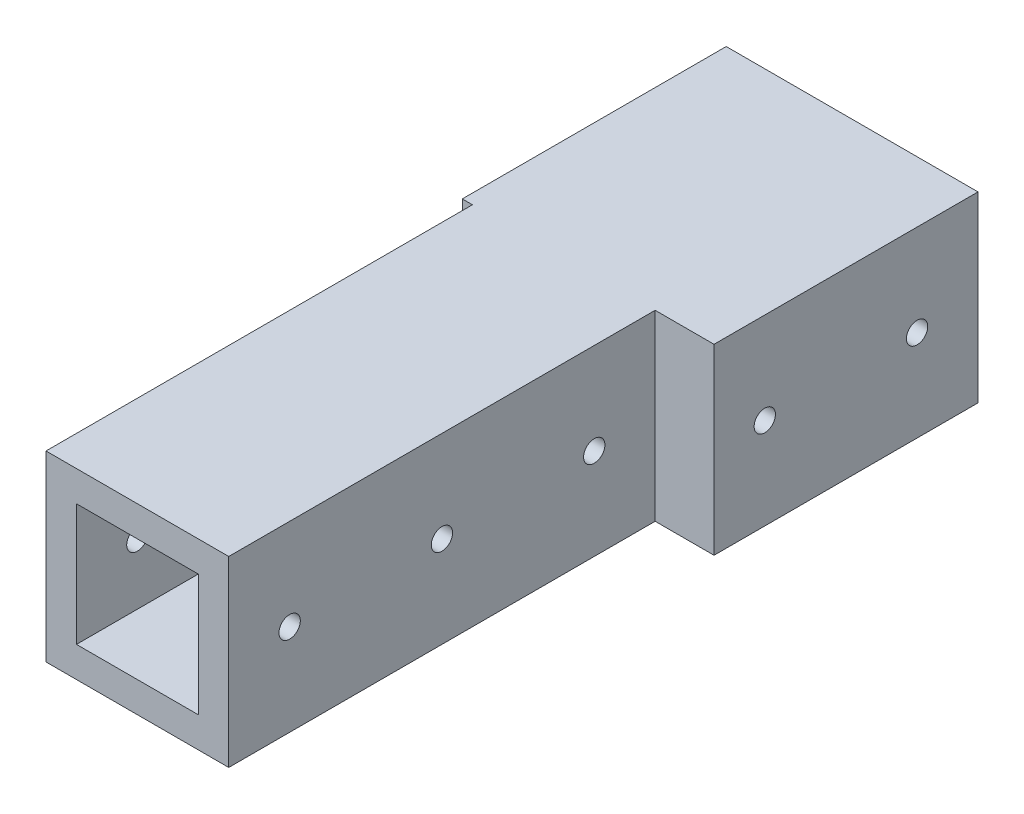
ISO-10303-21;
HEADER;
FILE_DESCRIPTION(('STEP AP214'),'2;1');
FILE_NAME('part.step','',(''),(''),'','','');
FILE_SCHEMA(('AUTOMOTIVE_DESIGN { 1 0 10303 214 1 1 1 1 }'));
ENDSEC;
DATA;
#1=APPLICATION_CONTEXT('core data for automotive mechanical design processes');
#2=APPLICATION_PROTOCOL_DEFINITION('international standard','automotive_design',2000,#1);
#3=PRODUCT_CONTEXT('',#1,'mechanical');
#4=PRODUCT('Part','Part','',(#3));
#5=PRODUCT_RELATED_PRODUCT_CATEGORY('part','',(#4));
#6=PRODUCT_DEFINITION_FORMATION('','',#4);
#7=PRODUCT_DEFINITION_CONTEXT('part definition',#1,'design');
#8=PRODUCT_DEFINITION('design','',#6,#7);
#9=PRODUCT_DEFINITION_SHAPE('','',#8);
#10=(LENGTH_UNIT() NAMED_UNIT(*) SI_UNIT(.MILLI.,.METRE.));
#11=(NAMED_UNIT(*) PLANE_ANGLE_UNIT() SI_UNIT($,.RADIAN.));
#12=(NAMED_UNIT(*) SI_UNIT($,.STERADIAN.) SOLID_ANGLE_UNIT());
#13=UNCERTAINTY_MEASURE_WITH_UNIT(LENGTH_MEASURE(1.E-05),#10,'distance_accuracy_value','');
#14=(GEOMETRIC_REPRESENTATION_CONTEXT(3) GLOBAL_UNCERTAINTY_ASSIGNED_CONTEXT((#13)) GLOBAL_UNIT_ASSIGNED_CONTEXT((#10,
#11,#12)) REPRESENTATION_CONTEXT('',''));
#15=CARTESIAN_POINT('',(0.,0.,0.));
#16=DIRECTION('',(0.,0.,1.));
#17=DIRECTION('',(1.,0.,0.));
#18=AXIS2_PLACEMENT_3D('',#15,#16,#17);
#19=CARTESIAN_POINT('',(0.,0.,68.));
#20=DIRECTION('',(1.,0.,0.));
#21=DIRECTION('',(0.,1.,0.));
#22=AXIS2_PLACEMENT_3D('',#19,#20,#21);
#23=PLANE('',#22);
#24=CARTESIAN_POINT('',(0.,-9.,32.));
#25=DIRECTION('',(1.,0.,0.));
#26=DIRECTION('',(0.,1.,0.));
#27=AXIS2_PLACEMENT_3D('',#24,#25,#26);
#28=CIRCLE('',#27,1.05);
#29=CARTESIAN_POINT('',(0.,-7.95,32.));
#30=VERTEX_POINT('',#29);
#31=EDGE_CURVE('E235',#30,#30,#28,.T.);
#32=ORIENTED_EDGE('',*,*,#31,.T.);
#33=EDGE_LOOP('',(#32));
#34=FACE_BOUND('',#33,.T.);
#35=CARTESIAN_POINT('',(0.,-9.,47.));
#36=DIRECTION('',(1.,0.,0.));
#37=DIRECTION('',(0.,1.,0.));
#38=AXIS2_PLACEMENT_3D('',#35,#36,#37);
#39=CIRCLE('',#38,1.05);
#40=CARTESIAN_POINT('',(0.,-7.95,47.));
#41=VERTEX_POINT('',#40);
#42=EDGE_CURVE('E241',#41,#41,#39,.T.);
#43=ORIENTED_EDGE('',*,*,#42,.T.);
#44=EDGE_LOOP('',(#43));
#45=FACE_BOUND('',#44,.T.);
#46=CARTESIAN_POINT('',(0.,-9.,62.));
#47=DIRECTION('',(1.,0.,0.));
#48=DIRECTION('',(0.,1.,0.));
#49=AXIS2_PLACEMENT_3D('',#46,#47,#48);
#50=CIRCLE('',#49,1.05);
#51=CARTESIAN_POINT('',(0.,-7.95,62.));
#52=VERTEX_POINT('',#51);
#53=EDGE_CURVE('E248',#52,#52,#50,.T.);
#54=ORIENTED_EDGE('',*,*,#53,.T.);
#55=EDGE_LOOP('',(#54));
#56=FACE_BOUND('',#55,.T.);
#57=DIRECTION('',(0.,1.,0.));
#58=VECTOR('',#57,1.);
#59=CARTESIAN_POINT('',(0.,0.,26.));
#60=LINE('',#59,#58);
#61=CARTESIAN_POINT('',(0.,-18.,26.));
#62=VERTEX_POINT('',#61);
#63=CARTESIAN_POINT('',(0.,0.,26.));
#64=VERTEX_POINT('',#63);
#65=EDGE_CURVE('E65',#62,#64,#60,.T.);
#66=ORIENTED_EDGE('',*,*,#65,.F.);
#67=DIRECTION('',(0.,0.,-1.));
#68=VECTOR('',#67,1.);
#69=CARTESIAN_POINT('',(0.,-18.,68.));
#70=LINE('',#69,#68);
#71=CARTESIAN_POINT('',(0.,-18.,68.));
#72=VERTEX_POINT('',#71);
#73=EDGE_CURVE('E11',#72,#62,#70,.T.);
#74=ORIENTED_EDGE('',*,*,#73,.F.);
#75=DIRECTION('',(0.,-1.,0.));
#76=VECTOR('',#75,1.);
#77=CARTESIAN_POINT('',(0.,0.,68.));
#78=LINE('',#77,#76);
#79=CARTESIAN_POINT('',(0.,0.,68.));
#80=VERTEX_POINT('',#79);
#81=EDGE_CURVE('E294',#80,#72,#78,.T.);
#82=ORIENTED_EDGE('',*,*,#81,.F.);
#83=DIRECTION('',(0.,0.,-1.));
#84=VECTOR('',#83,1.);
#85=CARTESIAN_POINT('',(0.,0.,68.));
#86=LINE('',#85,#84);
#87=EDGE_CURVE('E310',#80,#64,#86,.T.);
#88=ORIENTED_EDGE('',*,*,#87,.T.);
#89=EDGE_LOOP('',(#66,#74,#82,#88));
#90=FACE_BOUND('',#89,.T.);
#91=ADVANCED_FACE('F44',(#34,#45,#56,#90),#23,.F.);
#92=CARTESIAN_POINT('',(18.,0.,68.));
#93=DIRECTION('',(-1.,0.,0.));
#94=DIRECTION('',(0.,0.,1.));
#95=AXIS2_PLACEMENT_3D('',#92,#93,#94);
#96=PLANE('',#95);
#97=CARTESIAN_POINT('',(18.,-9.,32.));
#98=DIRECTION('',(1.,0.,0.));
#99=DIRECTION('',(0.,0.,-1.));
#100=AXIS2_PLACEMENT_3D('',#97,#98,#99);
#101=CIRCLE('',#100,1.05);
#102=CARTESIAN_POINT('',(18.,-9.,30.95));
#103=VERTEX_POINT('',#102);
#104=EDGE_CURVE('E204',#103,#103,#101,.T.);
#105=ORIENTED_EDGE('',*,*,#104,.F.);
#106=EDGE_LOOP('',(#105));
#107=FACE_BOUND('',#106,.T.);
#108=CARTESIAN_POINT('',(18.,-9.,47.));
#109=DIRECTION('',(1.,0.,0.));
#110=DIRECTION('',(0.,0.,-1.));
#111=AXIS2_PLACEMENT_3D('',#108,#109,#110);
#112=CIRCLE('',#111,1.05);
#113=CARTESIAN_POINT('',(18.,-9.,45.95));
#114=VERTEX_POINT('',#113);
#115=EDGE_CURVE('E212',#114,#114,#112,.T.);
#116=ORIENTED_EDGE('',*,*,#115,.F.);
#117=EDGE_LOOP('',(#116));
#118=FACE_BOUND('',#117,.T.);
#119=CARTESIAN_POINT('',(18.,-9.,62.));
#120=DIRECTION('',(1.,0.,0.));
#121=DIRECTION('',(0.,0.,-1.));
#122=AXIS2_PLACEMENT_3D('',#119,#120,#121);
#123=CIRCLE('',#122,1.05);
#124=CARTESIAN_POINT('',(18.,-9.,60.95));
#125=VERTEX_POINT('',#124);
#126=EDGE_CURVE('E207',#125,#125,#123,.T.);
#127=ORIENTED_EDGE('',*,*,#126,.F.);
#128=EDGE_LOOP('',(#127));
#129=FACE_BOUND('',#128,.T.);
#130=DIRECTION('',(0.,-1.,0.));
#131=VECTOR('',#130,1.);
#132=CARTESIAN_POINT('',(18.,0.,26.));
#133=LINE('',#132,#131);
#134=CARTESIAN_POINT('',(18.,0.,26.));
#135=VERTEX_POINT('',#134);
#136=CARTESIAN_POINT('',(18.,-18.,26.));
#137=VERTEX_POINT('',#136);
#138=EDGE_CURVE('E67',#135,#137,#133,.T.);
#139=ORIENTED_EDGE('',*,*,#138,.F.);
#140=DIRECTION('',(0.,0.,-1.));
#141=VECTOR('',#140,1.);
#142=CARTESIAN_POINT('',(18.,0.,68.));
#143=LINE('',#142,#141);
#144=CARTESIAN_POINT('',(18.,0.,68.));
#145=VERTEX_POINT('',#144);
#146=EDGE_CURVE('E312',#145,#135,#143,.T.);
#147=ORIENTED_EDGE('',*,*,#146,.F.);
#148=DIRECTION('',(0.,1.,0.));
#149=VECTOR('',#148,1.);
#150=CARTESIAN_POINT('',(18.,0.,68.));
#151=LINE('',#150,#149);
#152=CARTESIAN_POINT('',(18.,-18.,68.));
#153=VERTEX_POINT('',#152);
#154=EDGE_CURVE('E305',#153,#145,#151,.T.);
#155=ORIENTED_EDGE('',*,*,#154,.F.);
#156=DIRECTION('',(0.,0.,-1.));
#157=VECTOR('',#156,1.);
#158=CARTESIAN_POINT('',(18.,-18.,68.));
#159=LINE('',#158,#157);
#160=EDGE_CURVE('E53',#153,#137,#159,.T.);
#161=ORIENTED_EDGE('',*,*,#160,.T.);
#162=EDGE_LOOP('',(#139,#147,#155,#161));
#163=FACE_BOUND('',#162,.T.);
#164=ADVANCED_FACE('F372',(#107,#118,#129,#163),#96,.F.);
#165=CARTESIAN_POINT('',(0.,0.,68.));
#166=DIRECTION('',(0.,0.,1.));
#167=DIRECTION('',(1.,0.,0.));
#168=AXIS2_PLACEMENT_3D('',#165,#166,#167);
#169=PLANE('',#168);
#170=ORIENTED_EDGE('',*,*,#81,.T.);
#171=DIRECTION('',(1.,0.,0.));
#172=VECTOR('',#171,1.);
#173=CARTESIAN_POINT('',(0.,-18.,68.));
#174=LINE('',#173,#172);
#175=EDGE_CURVE('E299',#72,#153,#174,.T.);
#176=ORIENTED_EDGE('',*,*,#175,.T.);
#177=ORIENTED_EDGE('',*,*,#154,.T.);
#178=DIRECTION('',(-1.,0.,0.));
#179=VECTOR('',#178,1.);
#180=CARTESIAN_POINT('',(0.,0.,68.));
#181=LINE('',#180,#179);
#182=EDGE_CURVE('E304',#145,#80,#181,.T.);
#183=ORIENTED_EDGE('',*,*,#182,.T.);
#184=EDGE_LOOP('',(#170,#176,#177,#183));
#185=FACE_BOUND('',#184,.T.);
#186=DIRECTION('',(1.,0.,0.));
#187=VECTOR('',#186,1.);
#188=CARTESIAN_POINT('',(3.,-15.,68.));
#189=LINE('',#188,#187);
#190=CARTESIAN_POINT('',(3.,-15.,68.));
#191=VERTEX_POINT('',#190);
#192=CARTESIAN_POINT('',(15.,-15.,68.));
#193=VERTEX_POINT('',#192);
#194=EDGE_CURVE('E260',#191,#193,#189,.T.);
#195=ORIENTED_EDGE('',*,*,#194,.F.);
#196=DIRECTION('',(0.,-1.,0.));
#197=VECTOR('',#196,1.);
#198=CARTESIAN_POINT('',(3.,-3.,68.));
#199=LINE('',#198,#197);
#200=CARTESIAN_POINT('',(3.,-3.,68.));
#201=VERTEX_POINT('',#200);
#202=EDGE_CURVE('E251',#201,#191,#199,.T.);
#203=ORIENTED_EDGE('',*,*,#202,.F.);
#204=DIRECTION('',(-1.,0.,0.));
#205=VECTOR('',#204,1.);
#206=CARTESIAN_POINT('',(3.,-3.,68.));
#207=LINE('',#206,#205);
#208=CARTESIAN_POINT('',(15.,-3.,68.));
#209=VERTEX_POINT('',#208);
#210=EDGE_CURVE('E264',#209,#201,#207,.T.);
#211=ORIENTED_EDGE('',*,*,#210,.F.);
#212=DIRECTION('',(0.,1.,0.));
#213=VECTOR('',#212,1.);
#214=CARTESIAN_POINT('',(15.,-3.,68.));
#215=LINE('',#214,#213);
#216=EDGE_CURVE('E261',#193,#209,#215,.T.);
#217=ORIENTED_EDGE('',*,*,#216,.F.);
#218=EDGE_LOOP('',(#195,#203,#211,#217));
#219=FACE_BOUND('',#218,.T.);
#220=ADVANCED_FACE('F360',(#185,#219),#169,.T.);
#221=CARTESIAN_POINT('',(0.,0.,0.));
#222=DIRECTION('',(0.,0.,1.));
#223=DIRECTION('',(1.,0.,0.));
#224=AXIS2_PLACEMENT_3D('',#221,#222,#223);
#225=PLANE('',#224);
#226=DIRECTION('',(1.,0.,0.));
#227=VECTOR('',#226,1.);
#228=CARTESIAN_POINT('',(0.,-18.,0.));
#229=LINE('',#228,#227);
#230=CARTESIAN_POINT('',(-0.999999999999998,-18.,0.));
#231=VERTEX_POINT('',#230);
#232=CARTESIAN_POINT('',(23.8,-18.,0.));
#233=VERTEX_POINT('',#232);
#234=EDGE_CURVE('E140',#231,#233,#229,.T.);
#235=ORIENTED_EDGE('',*,*,#234,.F.);
#236=DIRECTION('',(0.,-1.,0.));
#237=VECTOR('',#236,1.);
#238=CARTESIAN_POINT('',(-1.,0.,0.));
#239=LINE('',#238,#237);
#240=CARTESIAN_POINT('',(-1.,0.,0.));
#241=VERTEX_POINT('',#240);
#242=EDGE_CURVE('E145',#241,#231,#239,.T.);
#243=ORIENTED_EDGE('',*,*,#242,.F.);
#244=DIRECTION('',(-1.,0.,0.));
#245=VECTOR('',#244,1.);
#246=CARTESIAN_POINT('',(0.,0.,0.));
#247=LINE('',#246,#245);
#248=CARTESIAN_POINT('',(23.8,0.,0.));
#249=VERTEX_POINT('',#248);
#250=EDGE_CURVE('E149',#249,#241,#247,.T.);
#251=ORIENTED_EDGE('',*,*,#250,.F.);
#252=DIRECTION('',(0.,1.,0.));
#253=VECTOR('',#252,1.);
#254=CARTESIAN_POINT('',(23.8,0.,0.));
#255=LINE('',#254,#253);
#256=EDGE_CURVE('E144',#233,#249,#255,.T.);
#257=ORIENTED_EDGE('',*,*,#256,.F.);
#258=EDGE_LOOP('',(#235,#243,#251,#257));
#259=FACE_BOUND('',#258,.T.);
#260=DIRECTION('',(0.,-1.,0.));
#261=VECTOR('',#260,1.);
#262=CARTESIAN_POINT('',(3.,-3.,0.));
#263=LINE('',#262,#261);
#264=CARTESIAN_POINT('',(3.,-3.,0.));
#265=VERTEX_POINT('',#264);
#266=CARTESIAN_POINT('',(3.,-15.,0.));
#267=VERTEX_POINT('',#266);
#268=EDGE_CURVE('E254',#265,#267,#263,.T.);
#269=ORIENTED_EDGE('',*,*,#268,.T.);
#270=DIRECTION('',(1.,0.,0.));
#271=VECTOR('',#270,1.);
#272=CARTESIAN_POINT('',(3.,-15.,0.));
#273=LINE('',#272,#271);
#274=CARTESIAN_POINT('',(15.,-15.,0.));
#275=VERTEX_POINT('',#274);
#276=EDGE_CURVE('E275',#267,#275,#273,.T.);
#277=ORIENTED_EDGE('',*,*,#276,.T.);
#278=DIRECTION('',(0.,1.,0.));
#279=VECTOR('',#278,1.);
#280=CARTESIAN_POINT('',(15.,-3.,0.));
#281=LINE('',#280,#279);
#282=CARTESIAN_POINT('',(15.,-3.,0.));
#283=VERTEX_POINT('',#282);
#284=EDGE_CURVE('E277',#275,#283,#281,.T.);
#285=ORIENTED_EDGE('',*,*,#284,.T.);
#286=DIRECTION('',(-1.,0.,0.));
#287=VECTOR('',#286,1.);
#288=CARTESIAN_POINT('',(3.,-3.,0.));
#289=LINE('',#288,#287);
#290=EDGE_CURVE('E259',#283,#265,#289,.T.);
#291=ORIENTED_EDGE('',*,*,#290,.T.);
#292=EDGE_LOOP('',(#269,#277,#285,#291));
#293=FACE_BOUND('',#292,.T.);
#294=ADVANCED_FACE('F138',(#259,#293),#225,.F.);
#295=CARTESIAN_POINT('',(0.,-18.,68.));
#296=DIRECTION('',(0.,1.,0.));
#297=DIRECTION('',(0.,0.,1.));
#298=AXIS2_PLACEMENT_3D('',#295,#296,#297);
#299=PLANE('',#298);
#300=ORIENTED_EDGE('',*,*,#234,.T.);
#301=DIRECTION('',(0.,0.,-1.));
#302=VECTOR('',#301,1.);
#303=CARTESIAN_POINT('',(23.8,-18.,26.));
#304=LINE('',#303,#302);
#305=CARTESIAN_POINT('',(23.8,-18.,26.));
#306=VERTEX_POINT('',#305);
#307=EDGE_CURVE('E190',#306,#233,#304,.T.);
#308=ORIENTED_EDGE('',*,*,#307,.F.);
#309=DIRECTION('',(-1.,0.,0.));
#310=VECTOR('',#309,1.);
#311=CARTESIAN_POINT('',(23.8,-18.,26.));
#312=LINE('',#311,#310);
#313=EDGE_CURVE('E201',#306,#137,#312,.T.);
#314=ORIENTED_EDGE('',*,*,#313,.T.);
#315=ORIENTED_EDGE('',*,*,#160,.F.);
#316=ORIENTED_EDGE('',*,*,#175,.F.);
#317=ORIENTED_EDGE('',*,*,#73,.T.);
#318=DIRECTION('',(1.,0.,0.));
#319=VECTOR('',#318,1.);
#320=CARTESIAN_POINT('',(-0.999999999999998,-18.,26.));
#321=LINE('',#320,#319);
#322=CARTESIAN_POINT('',(-0.999999999999998,-18.,26.));
#323=VERTEX_POINT('',#322);
#324=EDGE_CURVE('E154',#323,#62,#321,.T.);
#325=ORIENTED_EDGE('',*,*,#324,.F.);
#326=DIRECTION('',(0.,0.,1.));
#327=VECTOR('',#326,1.);
#328=CARTESIAN_POINT('',(-0.999999999999998,-18.,0.));
#329=LINE('',#328,#327);
#330=EDGE_CURVE('E155',#231,#323,#329,.T.);
#331=ORIENTED_EDGE('',*,*,#330,.F.);
#332=EDGE_LOOP('',(#300,#308,#314,#315,#316,#317,#325,#331));
#333=FACE_BOUND('',#332,.T.);
#334=ADVANCED_FACE('F153',(#333),#299,.F.);
#335=CARTESIAN_POINT('',(0.,0.,68.));
#336=DIRECTION('',(0.,-1.,0.));
#337=DIRECTION('',(0.,0.,-1.));
#338=AXIS2_PLACEMENT_3D('',#335,#336,#337);
#339=PLANE('',#338);
#340=ORIENTED_EDGE('',*,*,#250,.T.);
#341=DIRECTION('',(0.,0.,-1.));
#342=VECTOR('',#341,1.);
#343=CARTESIAN_POINT('',(-1.,0.,0.));
#344=LINE('',#343,#342);
#345=CARTESIAN_POINT('',(-1.,0.,26.));
#346=VERTEX_POINT('',#345);
#347=EDGE_CURVE('E165',#346,#241,#344,.T.);
#348=ORIENTED_EDGE('',*,*,#347,.F.);
#349=DIRECTION('',(1.,0.,0.));
#350=VECTOR('',#349,1.);
#351=CARTESIAN_POINT('',(-1.,0.,26.));
#352=LINE('',#351,#350);
#353=EDGE_CURVE('E176',#346,#64,#352,.T.);
#354=ORIENTED_EDGE('',*,*,#353,.T.);
#355=ORIENTED_EDGE('',*,*,#87,.F.);
#356=ORIENTED_EDGE('',*,*,#182,.F.);
#357=ORIENTED_EDGE('',*,*,#146,.T.);
#358=DIRECTION('',(-1.,0.,0.));
#359=VECTOR('',#358,1.);
#360=CARTESIAN_POINT('',(23.8,0.,26.));
#361=LINE('',#360,#359);
#362=CARTESIAN_POINT('',(23.8,0.,26.));
#363=VERTEX_POINT('',#362);
#364=EDGE_CURVE('E193',#363,#135,#361,.T.);
#365=ORIENTED_EDGE('',*,*,#364,.F.);
#366=DIRECTION('',(0.,0.,1.));
#367=VECTOR('',#366,1.);
#368=CARTESIAN_POINT('',(23.8,0.,26.));
#369=LINE('',#368,#367);
#370=EDGE_CURVE('E195',#249,#363,#369,.T.);
#371=ORIENTED_EDGE('',*,*,#370,.F.);
#372=EDGE_LOOP('',(#340,#348,#354,#355,#356,#357,#365,#371));
#373=FACE_BOUND('',#372,.T.);
#374=ADVANCED_FACE('F471',(#373),#339,.F.);
#375=CARTESIAN_POINT('',(3.,-3.,68.));
#376=DIRECTION('',(1.,0.,0.));
#377=DIRECTION('',(0.,1.,0.));
#378=AXIS2_PLACEMENT_3D('',#375,#376,#377);
#379=PLANE('',#378);
#380=CARTESIAN_POINT('',(3.,-9.,62.));
#381=DIRECTION('',(1.,0.,0.));
#382=DIRECTION('',(0.,1.,0.));
#383=AXIS2_PLACEMENT_3D('',#380,#381,#382);
#384=CIRCLE('',#383,1.05);
#385=CARTESIAN_POINT('',(3.,-7.95,62.));
#386=VERTEX_POINT('',#385);
#387=EDGE_CURVE('E244',#386,#386,#384,.T.);
#388=ORIENTED_EDGE('',*,*,#387,.F.);
#389=EDGE_LOOP('',(#388));
#390=FACE_BOUND('',#389,.T.);
#391=CARTESIAN_POINT('',(3.,-9.,47.));
#392=DIRECTION('',(1.,0.,0.));
#393=DIRECTION('',(0.,1.,0.));
#394=AXIS2_PLACEMENT_3D('',#391,#392,#393);
#395=CIRCLE('',#394,1.05);
#396=CARTESIAN_POINT('',(3.,-7.95,47.));
#397=VERTEX_POINT('',#396);
#398=EDGE_CURVE('E240',#397,#397,#395,.T.);
#399=ORIENTED_EDGE('',*,*,#398,.F.);
#400=EDGE_LOOP('',(#399));
#401=FACE_BOUND('',#400,.T.);
#402=CARTESIAN_POINT('',(3.,-9.,32.));
#403=DIRECTION('',(1.,0.,0.));
#404=DIRECTION('',(0.,1.,0.));
#405=AXIS2_PLACEMENT_3D('',#402,#403,#404);
#406=CIRCLE('',#405,1.05);
#407=CARTESIAN_POINT('',(3.,-7.95,32.));
#408=VERTEX_POINT('',#407);
#409=EDGE_CURVE('E226',#408,#408,#406,.T.);
#410=ORIENTED_EDGE('',*,*,#409,.F.);
#411=EDGE_LOOP('',(#410));
#412=FACE_BOUND('',#411,.T.);
#413=CARTESIAN_POINT('',(3.,-9.,21.));
#414=DIRECTION('',(1.,0.,0.));
#415=DIRECTION('',(0.,1.,0.));
#416=AXIS2_PLACEMENT_3D('',#413,#414,#415);
#417=CIRCLE('',#416,1.05);
#418=CARTESIAN_POINT('',(3.,-7.95,21.));
#419=VERTEX_POINT('',#418);
#420=EDGE_CURVE('E222',#419,#419,#417,.T.);
#421=ORIENTED_EDGE('',*,*,#420,.F.);
#422=EDGE_LOOP('',(#421));
#423=FACE_BOUND('',#422,.T.);
#424=CARTESIAN_POINT('',(3.,-9.,6.00000000000002));
#425=DIRECTION('',(1.,0.,0.));
#426=DIRECTION('',(0.,1.,0.));
#427=AXIS2_PLACEMENT_3D('',#424,#425,#426);
#428=CIRCLE('',#427,1.05);
#429=CARTESIAN_POINT('',(3.,-7.95,6.00000000000002));
#430=VERTEX_POINT('',#429);
#431=EDGE_CURVE('E218',#430,#430,#428,.T.);
#432=ORIENTED_EDGE('',*,*,#431,.F.);
#433=EDGE_LOOP('',(#432));
#434=FACE_BOUND('',#433,.T.);
#435=ORIENTED_EDGE('',*,*,#268,.F.);
#436=DIRECTION('',(0.,0.,-1.));
#437=VECTOR('',#436,1.);
#438=CARTESIAN_POINT('',(3.,-3.,68.));
#439=LINE('',#438,#437);
#440=EDGE_CURVE('E267',#201,#265,#439,.T.);
#441=ORIENTED_EDGE('',*,*,#440,.F.);
#442=ORIENTED_EDGE('',*,*,#202,.T.);
#443=DIRECTION('',(0.,0.,-1.));
#444=VECTOR('',#443,1.);
#445=CARTESIAN_POINT('',(3.,-15.,68.));
#446=LINE('',#445,#444);
#447=EDGE_CURVE('E146',#191,#267,#446,.T.);
#448=ORIENTED_EDGE('',*,*,#447,.T.);
#449=EDGE_LOOP('',(#435,#441,#442,#448));
#450=FACE_BOUND('',#449,.T.);
#451=ADVANCED_FACE('F353',(#390,#401,#412,#423,#434,#450),#379,.T.);
#452=CARTESIAN_POINT('',(3.,-15.,68.));
#453=DIRECTION('',(0.,1.,0.));
#454=DIRECTION('',(0.,0.,1.));
#455=AXIS2_PLACEMENT_3D('',#452,#453,#454);
#456=PLANE('',#455);
#457=ORIENTED_EDGE('',*,*,#276,.F.);
#458=ORIENTED_EDGE('',*,*,#447,.F.);
#459=ORIENTED_EDGE('',*,*,#194,.T.);
#460=DIRECTION('',(0.,0.,-1.));
#461=VECTOR('',#460,1.);
#462=CARTESIAN_POINT('',(15.,-15.,68.));
#463=LINE('',#462,#461);
#464=EDGE_CURVE('E288',#193,#275,#463,.T.);
#465=ORIENTED_EDGE('',*,*,#464,.T.);
#466=EDGE_LOOP('',(#457,#458,#459,#465));
#467=FACE_BOUND('',#466,.T.);
#468=ADVANCED_FACE('F340',(#467),#456,.T.);
#469=CARTESIAN_POINT('',(15.,-3.,68.));
#470=DIRECTION('',(-1.,0.,0.));
#471=DIRECTION('',(0.,-1.,0.));
#472=AXIS2_PLACEMENT_3D('',#469,#470,#471);
#473=PLANE('',#472);
#474=CARTESIAN_POINT('',(15.,-9.,62.));
#475=DIRECTION('',(-1.,0.,0.));
#476=DIRECTION('',(0.,-1.,0.));
#477=AXIS2_PLACEMENT_3D('',#474,#475,#476);
#478=CIRCLE('',#477,1.05);
#479=CARTESIAN_POINT('',(15.,-10.05,62.));
#480=VERTEX_POINT('',#479);
#481=EDGE_CURVE('E48',#480,#480,#478,.T.);
#482=ORIENTED_EDGE('',*,*,#481,.F.);
#483=EDGE_LOOP('',(#482));
#484=FACE_BOUND('',#483,.T.);
#485=CARTESIAN_POINT('',(15.,-9.,47.));
#486=DIRECTION('',(-1.,0.,0.));
#487=DIRECTION('',(0.,-1.,0.));
#488=AXIS2_PLACEMENT_3D('',#485,#486,#487);
#489=CIRCLE('',#488,1.05);
#490=CARTESIAN_POINT('',(15.,-10.05,47.));
#491=VERTEX_POINT('',#490);
#492=EDGE_CURVE('E236',#491,#491,#489,.T.);
#493=ORIENTED_EDGE('',*,*,#492,.F.);
#494=EDGE_LOOP('',(#493));
#495=FACE_BOUND('',#494,.T.);
#496=CARTESIAN_POINT('',(15.,-9.,32.));
#497=DIRECTION('',(-1.,0.,0.));
#498=DIRECTION('',(0.,-1.,0.));
#499=AXIS2_PLACEMENT_3D('',#496,#497,#498);
#500=CIRCLE('',#499,1.05);
#501=CARTESIAN_POINT('',(15.,-10.05,32.));
#502=VERTEX_POINT('',#501);
#503=EDGE_CURVE('E227',#502,#502,#500,.T.);
#504=ORIENTED_EDGE('',*,*,#503,.F.);
#505=EDGE_LOOP('',(#504));
#506=FACE_BOUND('',#505,.T.);
#507=CARTESIAN_POINT('',(15.,-9.,21.));
#508=DIRECTION('',(-1.,0.,0.));
#509=DIRECTION('',(0.,-1.,0.));
#510=AXIS2_PLACEMENT_3D('',#507,#508,#509);
#511=CIRCLE('',#510,1.05);
#512=CARTESIAN_POINT('',(15.,-10.05,21.));
#513=VERTEX_POINT('',#512);
#514=EDGE_CURVE('E225',#513,#513,#511,.T.);
#515=ORIENTED_EDGE('',*,*,#514,.F.);
#516=EDGE_LOOP('',(#515));
#517=FACE_BOUND('',#516,.T.);
#518=CARTESIAN_POINT('',(15.,-9.,6.00000000000002));
#519=DIRECTION('',(-1.,0.,0.));
#520=DIRECTION('',(0.,-1.,0.));
#521=AXIS2_PLACEMENT_3D('',#518,#519,#520);
#522=CIRCLE('',#521,1.05);
#523=CARTESIAN_POINT('',(15.,-10.05,6.00000000000002));
#524=VERTEX_POINT('',#523);
#525=EDGE_CURVE('E208',#524,#524,#522,.T.);
#526=ORIENTED_EDGE('',*,*,#525,.F.);
#527=EDGE_LOOP('',(#526));
#528=FACE_BOUND('',#527,.T.);
#529=ORIENTED_EDGE('',*,*,#284,.F.);
#530=ORIENTED_EDGE('',*,*,#464,.F.);
#531=ORIENTED_EDGE('',*,*,#216,.T.);
#532=DIRECTION('',(0.,0.,-1.));
#533=VECTOR('',#532,1.);
#534=CARTESIAN_POINT('',(15.,-3.,68.));
#535=LINE('',#534,#533);
#536=EDGE_CURVE('E286',#209,#283,#535,.T.);
#537=ORIENTED_EDGE('',*,*,#536,.T.);
#538=EDGE_LOOP('',(#529,#530,#531,#537));
#539=FACE_BOUND('',#538,.T.);
#540=ADVANCED_FACE('F332',(#484,#495,#506,#517,#528,#539),#473,.T.);
#541=CARTESIAN_POINT('',(3.,-3.,68.));
#542=DIRECTION('',(0.,-1.,0.));
#543=DIRECTION('',(0.,0.,-1.));
#544=AXIS2_PLACEMENT_3D('',#541,#542,#543);
#545=PLANE('',#544);
#546=ORIENTED_EDGE('',*,*,#290,.F.);
#547=ORIENTED_EDGE('',*,*,#536,.F.);
#548=ORIENTED_EDGE('',*,*,#210,.T.);
#549=ORIENTED_EDGE('',*,*,#440,.T.);
#550=EDGE_LOOP('',(#546,#547,#548,#549));
#551=FACE_BOUND('',#550,.T.);
#552=ADVANCED_FACE('F337',(#551),#545,.T.);
#553=CARTESIAN_POINT('',(-14.,-9.,6.00000000000002));
#554=DIRECTION('',(1.,0.,0.));
#555=DIRECTION('',(0.,0.,-1.));
#556=AXIS2_PLACEMENT_3D('',#553,#554,#555);
#557=CYLINDRICAL_SURFACE('',#556,1.05);
#558=ORIENTED_EDGE('',*,*,#525,.T.);
#559=EDGE_LOOP('',(#558));
#560=FACE_BOUND('',#559,.T.);
#561=CARTESIAN_POINT('',(23.8,-9.,6.));
#562=DIRECTION('',(1.,0.,0.));
#563=DIRECTION('',(0.,0.,-1.));
#564=AXIS2_PLACEMENT_3D('',#561,#562,#563);
#565=CIRCLE('',#564,1.05);
#566=CARTESIAN_POINT('',(23.8,-9.,4.95));
#567=VERTEX_POINT('',#566);
#568=EDGE_CURVE('E447',#567,#567,#565,.T.);
#569=ORIENTED_EDGE('',*,*,#568,.T.);
#570=EDGE_LOOP('',(#569));
#571=FACE_BOUND('',#570,.T.);
#572=ADVANCED_FACE('F365',(#560,#571),#557,.F.);
#573=CARTESIAN_POINT('',(-14.,-9.,21.));
#574=DIRECTION('',(1.,0.,0.));
#575=DIRECTION('',(0.,0.,-1.));
#576=AXIS2_PLACEMENT_3D('',#573,#574,#575);
#577=CYLINDRICAL_SURFACE('',#576,1.05);
#578=ORIENTED_EDGE('',*,*,#514,.T.);
#579=EDGE_LOOP('',(#578));
#580=FACE_BOUND('',#579,.T.);
#581=CARTESIAN_POINT('',(23.8,-9.,21.));
#582=DIRECTION('',(1.,0.,0.));
#583=DIRECTION('',(0.,0.,-1.));
#584=AXIS2_PLACEMENT_3D('',#581,#582,#583);
#585=CIRCLE('',#584,1.05);
#586=CARTESIAN_POINT('',(23.8,-9.,19.95));
#587=VERTEX_POINT('',#586);
#588=EDGE_CURVE('E452',#587,#587,#585,.T.);
#589=ORIENTED_EDGE('',*,*,#588,.T.);
#590=EDGE_LOOP('',(#589));
#591=FACE_BOUND('',#590,.T.);
#592=ADVANCED_FACE('F367',(#580,#591),#577,.F.);
#593=CARTESIAN_POINT('',(-14.,-9.,32.));
#594=DIRECTION('',(1.,0.,0.));
#595=DIRECTION('',(0.,0.,-1.));
#596=AXIS2_PLACEMENT_3D('',#593,#594,#595);
#597=CYLINDRICAL_SURFACE('',#596,1.05);
#598=ORIENTED_EDGE('',*,*,#503,.T.);
#599=EDGE_LOOP('',(#598));
#600=FACE_BOUND('',#599,.T.);
#601=ORIENTED_EDGE('',*,*,#104,.T.);
#602=EDGE_LOOP('',(#601));
#603=FACE_BOUND('',#602,.T.);
#604=ADVANCED_FACE('F416',(#600,#603),#597,.F.);
#605=CARTESIAN_POINT('',(-14.,-9.,47.));
#606=DIRECTION('',(1.,0.,0.));
#607=DIRECTION('',(0.,0.,-1.));
#608=AXIS2_PLACEMENT_3D('',#605,#606,#607);
#609=CYLINDRICAL_SURFACE('',#608,1.05);
#610=ORIENTED_EDGE('',*,*,#492,.T.);
#611=EDGE_LOOP('',(#610));
#612=FACE_BOUND('',#611,.T.);
#613=ORIENTED_EDGE('',*,*,#115,.T.);
#614=EDGE_LOOP('',(#613));
#615=FACE_BOUND('',#614,.T.);
#616=ADVANCED_FACE('F329',(#612,#615),#609,.F.);
#617=CARTESIAN_POINT('',(-14.,-9.,62.));
#618=DIRECTION('',(1.,0.,0.));
#619=DIRECTION('',(0.,0.,-1.));
#620=AXIS2_PLACEMENT_3D('',#617,#618,#619);
#621=CYLINDRICAL_SURFACE('',#620,1.05);
#622=ORIENTED_EDGE('',*,*,#481,.T.);
#623=EDGE_LOOP('',(#622));
#624=FACE_BOUND('',#623,.T.);
#625=ORIENTED_EDGE('',*,*,#126,.T.);
#626=EDGE_LOOP('',(#625));
#627=FACE_BOUND('',#626,.T.);
#628=ADVANCED_FACE('F394',(#624,#627),#621,.F.);
#629=ORIENTED_EDGE('',*,*,#431,.T.);
#630=EDGE_LOOP('',(#629));
#631=FACE_BOUND('',#630,.T.);
#632=CARTESIAN_POINT('',(-1.,-9.,6.));
#633=DIRECTION('',(-1.,0.,0.));
#634=DIRECTION('',(0.,-1.,0.));
#635=AXIS2_PLACEMENT_3D('',#632,#633,#634);
#636=CIRCLE('',#635,1.05);
#637=CARTESIAN_POINT('',(-1.,-10.05,6.));
#638=VERTEX_POINT('',#637);
#639=EDGE_CURVE('E166',#638,#638,#636,.T.);
#640=ORIENTED_EDGE('',*,*,#639,.T.);
#641=EDGE_LOOP('',(#640));
#642=FACE_BOUND('',#641,.T.);
#643=ADVANCED_FACE('F375',(#631,#642),#557,.F.);
#644=ORIENTED_EDGE('',*,*,#420,.T.);
#645=EDGE_LOOP('',(#644));
#646=FACE_BOUND('',#645,.T.);
#647=CARTESIAN_POINT('',(-1.,-9.,21.));
#648=DIRECTION('',(-1.,0.,0.));
#649=DIRECTION('',(0.,-1.,0.));
#650=AXIS2_PLACEMENT_3D('',#647,#648,#649);
#651=CIRCLE('',#650,1.05);
#652=CARTESIAN_POINT('',(-1.,-10.05,21.));
#653=VERTEX_POINT('',#652);
#654=EDGE_CURVE('E442',#653,#653,#651,.T.);
#655=ORIENTED_EDGE('',*,*,#654,.T.);
#656=EDGE_LOOP('',(#655));
#657=FACE_BOUND('',#656,.T.);
#658=ADVANCED_FACE('F412',(#646,#657),#577,.F.);
#659=ORIENTED_EDGE('',*,*,#409,.T.);
#660=EDGE_LOOP('',(#659));
#661=FACE_BOUND('',#660,.T.);
#662=ORIENTED_EDGE('',*,*,#31,.F.);
#663=EDGE_LOOP('',(#662));
#664=FACE_BOUND('',#663,.T.);
#665=ADVANCED_FACE('F401',(#661,#664),#597,.F.);
#666=ORIENTED_EDGE('',*,*,#398,.T.);
#667=EDGE_LOOP('',(#666));
#668=FACE_BOUND('',#667,.T.);
#669=ORIENTED_EDGE('',*,*,#42,.F.);
#670=EDGE_LOOP('',(#669));
#671=FACE_BOUND('',#670,.T.);
#672=ADVANCED_FACE('F395',(#668,#671),#609,.F.);
#673=ORIENTED_EDGE('',*,*,#387,.T.);
#674=EDGE_LOOP('',(#673));
#675=FACE_BOUND('',#674,.T.);
#676=ORIENTED_EDGE('',*,*,#53,.F.);
#677=EDGE_LOOP('',(#676));
#678=FACE_BOUND('',#677,.T.);
#679=ADVANCED_FACE('F386',(#675,#678),#621,.F.);
#680=CARTESIAN_POINT('',(23.8,0.,0.));
#681=DIRECTION('',(1.,0.,0.));
#682=DIRECTION('',(0.,0.,-1.));
#683=AXIS2_PLACEMENT_3D('',#680,#681,#682);
#684=PLANE('',#683);
#685=ORIENTED_EDGE('',*,*,#568,.F.);
#686=EDGE_LOOP('',(#685));
#687=FACE_BOUND('',#686,.T.);
#688=ORIENTED_EDGE('',*,*,#588,.F.);
#689=EDGE_LOOP('',(#688));
#690=FACE_BOUND('',#689,.T.);
#691=DIRECTION('',(0.,-1.,0.));
#692=VECTOR('',#691,1.);
#693=CARTESIAN_POINT('',(23.8,0.,26.));
#694=LINE('',#693,#692);
#695=EDGE_CURVE('E182',#363,#306,#694,.T.);
#696=ORIENTED_EDGE('',*,*,#695,.T.);
#697=ORIENTED_EDGE('',*,*,#307,.T.);
#698=ORIENTED_EDGE('',*,*,#256,.T.);
#699=ORIENTED_EDGE('',*,*,#370,.T.);
#700=EDGE_LOOP('',(#696,#697,#698,#699));
#701=FACE_BOUND('',#700,.T.);
#702=ADVANCED_FACE('F391',(#687,#690,#701),#684,.T.);
#703=CARTESIAN_POINT('',(23.8,0.,26.));
#704=DIRECTION('',(0.,0.,-1.));
#705=DIRECTION('',(0.,1.,0.));
#706=AXIS2_PLACEMENT_3D('',#703,#704,#705);
#707=PLANE('',#706);
#708=ORIENTED_EDGE('',*,*,#138,.T.);
#709=ORIENTED_EDGE('',*,*,#313,.F.);
#710=ORIENTED_EDGE('',*,*,#695,.F.);
#711=ORIENTED_EDGE('',*,*,#364,.T.);
#712=EDGE_LOOP('',(#708,#709,#710,#711));
#713=FACE_BOUND('',#712,.T.);
#714=ADVANCED_FACE('F399',(#713),#707,.F.);
#715=CARTESIAN_POINT('',(-1.,0.,0.));
#716=DIRECTION('',(-1.,0.,0.));
#717=DIRECTION('',(0.,-1.,0.));
#718=AXIS2_PLACEMENT_3D('',#715,#716,#717);
#719=PLANE('',#718);
#720=ORIENTED_EDGE('',*,*,#639,.F.);
#721=EDGE_LOOP('',(#720));
#722=FACE_BOUND('',#721,.T.);
#723=ORIENTED_EDGE('',*,*,#654,.F.);
#724=EDGE_LOOP('',(#723));
#725=FACE_BOUND('',#724,.T.);
#726=ORIENTED_EDGE('',*,*,#242,.T.);
#727=ORIENTED_EDGE('',*,*,#330,.T.);
#728=DIRECTION('',(0.,1.,0.));
#729=VECTOR('',#728,1.);
#730=CARTESIAN_POINT('',(-1.,0.,26.));
#731=LINE('',#730,#729);
#732=EDGE_CURVE('E158',#323,#346,#731,.T.);
#733=ORIENTED_EDGE('',*,*,#732,.T.);
#734=ORIENTED_EDGE('',*,*,#347,.T.);
#735=EDGE_LOOP('',(#726,#727,#733,#734));
#736=FACE_BOUND('',#735,.T.);
#737=ADVANCED_FACE('F162',(#722,#725,#736),#719,.T.);
#738=CARTESIAN_POINT('',(-1.,0.,26.));
#739=DIRECTION('',(0.,0.,-1.));
#740=DIRECTION('',(-1.,0.,0.));
#741=AXIS2_PLACEMENT_3D('',#738,#739,#740);
#742=PLANE('',#741);
#743=ORIENTED_EDGE('',*,*,#65,.T.);
#744=ORIENTED_EDGE('',*,*,#353,.F.);
#745=ORIENTED_EDGE('',*,*,#732,.F.);
#746=ORIENTED_EDGE('',*,*,#324,.T.);
#747=EDGE_LOOP('',(#743,#744,#745,#746));
#748=FACE_BOUND('',#747,.T.);
#749=ADVANCED_FACE('F472',(#748),#742,.F.);
#750=CLOSED_SHELL('',(#91,#164,#220,#294,#334,#374,#451,#468,#540,#552,#572,#592,#604,#616,#628,
#643,#658,#665,#672,#679,#702,#714,#737,#749));
#751=MANIFOLD_SOLID_BREP('B2',#750);
#752=ADVANCED_BREP_SHAPE_REPRESENTATION('',(#18,#751),#14);
#753=SHAPE_DEFINITION_REPRESENTATION(#9,#752);
ENDSEC;
END-ISO-10303-21;
